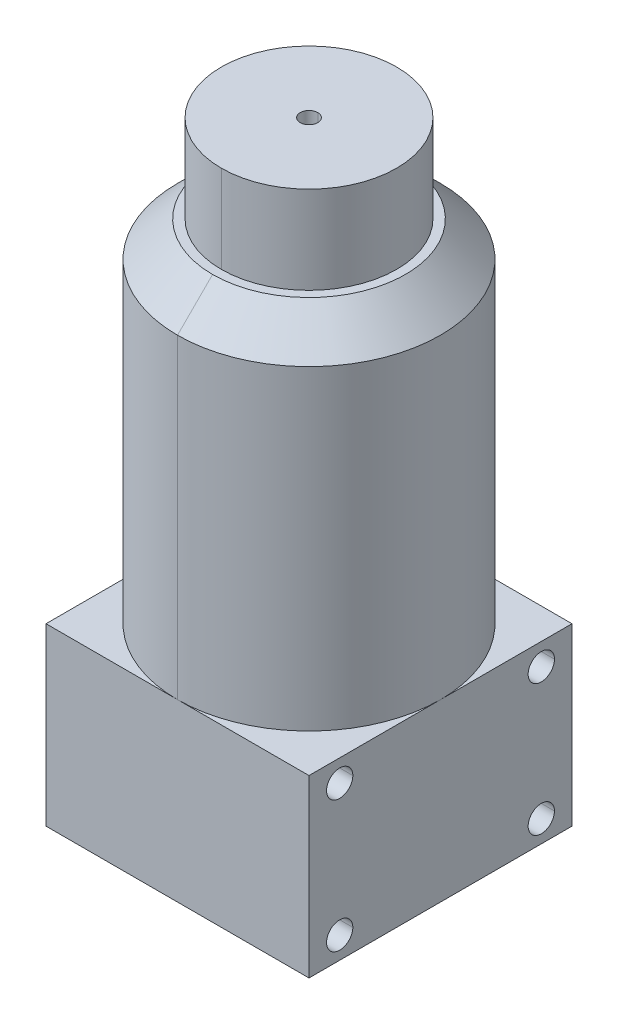
ISO-10303-21;
HEADER;
FILE_DESCRIPTION(('STEP AP214'),'2;1');
FILE_NAME('part.step','',(''),(''),'','','');
FILE_SCHEMA(('AUTOMOTIVE_DESIGN { 1 0 10303 214 1 1 1 1 }'));
ENDSEC;
DATA;
#1=APPLICATION_CONTEXT('core data for automotive mechanical design processes');
#2=APPLICATION_PROTOCOL_DEFINITION('international standard','automotive_design',2000,#1);
#3=PRODUCT_CONTEXT('',#1,'mechanical');
#4=PRODUCT('Part','Part','',(#3));
#5=PRODUCT_RELATED_PRODUCT_CATEGORY('part','',(#4));
#6=PRODUCT_DEFINITION_FORMATION('','',#4);
#7=PRODUCT_DEFINITION_CONTEXT('part definition',#1,'design');
#8=PRODUCT_DEFINITION('design','',#6,#7);
#9=PRODUCT_DEFINITION_SHAPE('','',#8);
#10=(LENGTH_UNIT() NAMED_UNIT(*) SI_UNIT(.MILLI.,.METRE.));
#11=(NAMED_UNIT(*) PLANE_ANGLE_UNIT() SI_UNIT($,.RADIAN.));
#12=(NAMED_UNIT(*) SI_UNIT($,.STERADIAN.) SOLID_ANGLE_UNIT());
#13=UNCERTAINTY_MEASURE_WITH_UNIT(LENGTH_MEASURE(1.E-05),#10,'distance_accuracy_value','');
#14=(GEOMETRIC_REPRESENTATION_CONTEXT(3) GLOBAL_UNCERTAINTY_ASSIGNED_CONTEXT((#13)) GLOBAL_UNIT_ASSIGNED_CONTEXT((#10,
#11,#12)) REPRESENTATION_CONTEXT('',''));
#15=CARTESIAN_POINT('',(0.,0.,0.));
#16=DIRECTION('',(0.,0.,1.));
#17=DIRECTION('',(1.,0.,0.));
#18=AXIS2_PLACEMENT_3D('',#15,#16,#17);
#19=CARTESIAN_POINT('',(0.,54.,0.));
#20=DIRECTION('',(0.,1.,0.));
#21=DIRECTION('',(1.,0.,0.));
#22=AXIS2_PLACEMENT_3D('',#19,#20,#21);
#23=PLANE('',#22);
#24=CARTESIAN_POINT('',(0.,54.,0.));
#25=DIRECTION('',(0.,1.,0.));
#26=DIRECTION('',(0.,0.,1.));
#27=AXIS2_PLACEMENT_3D('',#24,#25,#26);
#28=CIRCLE('',#27,1.);
#29=CARTESIAN_POINT('',(0.,54.,1.));
#30=VERTEX_POINT('',#29);
#31=CARTESIAN_POINT('',(0.,54.,-1.));
#32=VERTEX_POINT('',#31);
#33=EDGE_CURVE('E9',#30,#32,#28,.T.);
#34=ORIENTED_EDGE('',*,*,#33,.T.);
#35=CARTESIAN_POINT('',(0.,54.,0.));
#36=DIRECTION('',(0.,1.,0.));
#37=DIRECTION('',(0.,0.,1.));
#38=AXIS2_PLACEMENT_3D('',#35,#36,#37);
#39=CIRCLE('',#38,1.);
#40=EDGE_CURVE('E231',#32,#30,#39,.T.);
#41=ORIENTED_EDGE('',*,*,#40,.T.);
#42=EDGE_LOOP('',(#34,#41));
#43=FACE_BOUND('',#42,.T.);
#44=ADVANCED_FACE('F15',(#43),#23,.T.);
#45=CARTESIAN_POINT('',(0.,54.,0.));
#46=DIRECTION('',(0.,1.,0.));
#47=DIRECTION('',(0.,0.,1.));
#48=AXIS2_PLACEMENT_3D('',#45,#46,#47);
#49=CYLINDRICAL_SURFACE('',#48,1.);
#50=DIRECTION('',(0.,1.,0.));
#51=VECTOR('',#50,1.);
#52=CARTESIAN_POINT('',(0.,54.,-1.));
#53=LINE('',#52,#51);
#54=CARTESIAN_POINT('',(0.,70.,-1.));
#55=VERTEX_POINT('',#54);
#56=EDGE_CURVE('E212',#32,#55,#53,.T.);
#57=ORIENTED_EDGE('',*,*,#56,.F.);
#58=ORIENTED_EDGE('',*,*,#33,.F.);
#59=DIRECTION('',(0.,1.,0.));
#60=VECTOR('',#59,1.);
#61=CARTESIAN_POINT('',(0.,54.,1.));
#62=LINE('',#61,#60);
#63=CARTESIAN_POINT('',(0.,70.,1.));
#64=VERTEX_POINT('',#63);
#65=EDGE_CURVE('E211',#30,#64,#62,.T.);
#66=ORIENTED_EDGE('',*,*,#65,.T.);
#67=CARTESIAN_POINT('',(0.,70.,0.));
#68=DIRECTION('',(0.,1.,0.));
#69=DIRECTION('',(0.,0.,1.));
#70=AXIS2_PLACEMENT_3D('',#67,#68,#69);
#71=CIRCLE('',#70,1.);
#72=EDGE_CURVE('E26',#64,#55,#71,.T.);
#73=ORIENTED_EDGE('',*,*,#72,.T.);
#74=EDGE_LOOP('',(#57,#58,#66,#73));
#75=FACE_BOUND('',#74,.T.);
#76=ADVANCED_FACE('F652',(#75),#49,.F.);
#77=CARTESIAN_POINT('',(0.,60.,0.));
#78=DIRECTION('',(0.,-1.,0.));
#79=DIRECTION('',(0.,0.,-1.));
#80=AXIS2_PLACEMENT_3D('',#77,#78,#79);
#81=CONICAL_SURFACE('',#80,11.,0.785398163397447);
#82=DIRECTION('',(0.,-0.707106781186549,0.707106781186547));
#83=VECTOR('',#82,1.);
#84=CARTESIAN_POINT('',(0.,60.,11.));
#85=LINE('',#84,#83);
#86=CARTESIAN_POINT('',(0.,60.,11.));
#87=VERTEX_POINT('',#86);
#88=CARTESIAN_POINT('',(0.,56.,15.));
#89=VERTEX_POINT('',#88);
#90=EDGE_CURVE('E365',#87,#89,#85,.T.);
#91=ORIENTED_EDGE('',*,*,#90,.F.);
#92=CARTESIAN_POINT('',(0.,60.,0.));
#93=DIRECTION('',(0.,1.,0.));
#94=DIRECTION('',(0.,0.,1.));
#95=AXIS2_PLACEMENT_3D('',#92,#93,#94);
#96=CIRCLE('',#95,11.);
#97=CARTESIAN_POINT('',(0.,60.,-11.));
#98=VERTEX_POINT('',#97);
#99=EDGE_CURVE('E312',#98,#87,#96,.T.);
#100=ORIENTED_EDGE('',*,*,#99,.F.);
#101=DIRECTION('',(0.,-0.707106781186549,-0.707106781186547));
#102=VECTOR('',#101,1.);
#103=CARTESIAN_POINT('',(0.,60.,-11.));
#104=LINE('',#103,#102);
#105=CARTESIAN_POINT('',(0.,56.,-15.));
#106=VERTEX_POINT('',#105);
#107=EDGE_CURVE('E219',#98,#106,#104,.T.);
#108=ORIENTED_EDGE('',*,*,#107,.T.);
#109=CARTESIAN_POINT('',(0.,56.,0.));
#110=DIRECTION('',(0.,-1.,0.));
#111=DIRECTION('',(0.,0.,1.));
#112=AXIS2_PLACEMENT_3D('',#109,#110,#111);
#113=CIRCLE('',#112,15.);
#114=EDGE_CURVE('E336',#89,#106,#113,.T.);
#115=ORIENTED_EDGE('',*,*,#114,.F.);
#116=EDGE_LOOP('',(#91,#100,#108,#115));
#117=FACE_BOUND('',#116,.T.);
#118=ADVANCED_FACE('F647',(#117),#81,.T.);
#119=CARTESIAN_POINT('',(0.,70.,0.));
#120=DIRECTION('',(0.,1.,0.));
#121=DIRECTION('',(1.,0.,0.));
#122=AXIS2_PLACEMENT_3D('',#119,#120,#121);
#123=PLANE('',#122);
#124=ORIENTED_EDGE('',*,*,#72,.F.);
#125=CARTESIAN_POINT('',(0.,70.,0.));
#126=DIRECTION('',(0.,1.,0.));
#127=DIRECTION('',(0.,0.,1.));
#128=AXIS2_PLACEMENT_3D('',#125,#126,#127);
#129=CIRCLE('',#128,1.);
#130=EDGE_CURVE('E207',#55,#64,#129,.T.);
#131=ORIENTED_EDGE('',*,*,#130,.F.);
#132=EDGE_LOOP('',(#124,#131));
#133=FACE_BOUND('',#132,.T.);
#134=CARTESIAN_POINT('',(0.,70.,0.));
#135=DIRECTION('',(0.,1.,0.));
#136=DIRECTION('',(0.,0.,1.));
#137=AXIS2_PLACEMENT_3D('',#134,#135,#136);
#138=CIRCLE('',#137,10.);
#139=CARTESIAN_POINT('',(0.,70.,-10.));
#140=VERTEX_POINT('',#139);
#141=CARTESIAN_POINT('',(0.,70.,10.));
#142=VERTEX_POINT('',#141);
#143=EDGE_CURVE('E301',#140,#142,#138,.T.);
#144=ORIENTED_EDGE('',*,*,#143,.T.);
#145=CARTESIAN_POINT('',(0.,70.,0.));
#146=DIRECTION('',(0.,1.,0.));
#147=DIRECTION('',(0.,0.,1.));
#148=AXIS2_PLACEMENT_3D('',#145,#146,#147);
#149=CIRCLE('',#148,10.);
#150=EDGE_CURVE('E195',#142,#140,#149,.T.);
#151=ORIENTED_EDGE('',*,*,#150,.T.);
#152=EDGE_LOOP('',(#144,#151));
#153=FACE_BOUND('',#152,.T.);
#154=ADVANCED_FACE('F651',(#133,#153),#123,.T.);
#155=CARTESIAN_POINT('',(0.,70.,0.));
#156=DIRECTION('',(0.,-1.,0.));
#157=DIRECTION('',(0.,0.,-1.));
#158=AXIS2_PLACEMENT_3D('',#155,#156,#157);
#159=CYLINDRICAL_SURFACE('',#158,10.);
#160=DIRECTION('',(0.,-1.,0.));
#161=VECTOR('',#160,1.);
#162=CARTESIAN_POINT('',(0.,70.,10.));
#163=LINE('',#162,#161);
#164=CARTESIAN_POINT('',(0.,60.,10.));
#165=VERTEX_POINT('',#164);
#166=EDGE_CURVE('E328',#142,#165,#163,.T.);
#167=ORIENTED_EDGE('',*,*,#166,.F.);
#168=ORIENTED_EDGE('',*,*,#143,.F.);
#169=DIRECTION('',(0.,-1.,0.));
#170=VECTOR('',#169,1.);
#171=CARTESIAN_POINT('',(0.,70.,-10.));
#172=LINE('',#171,#170);
#173=CARTESIAN_POINT('',(0.,60.,-10.));
#174=VERTEX_POINT('',#173);
#175=EDGE_CURVE('E327',#140,#174,#172,.T.);
#176=ORIENTED_EDGE('',*,*,#175,.T.);
#177=CARTESIAN_POINT('',(0.,60.,0.));
#178=DIRECTION('',(0.,1.,0.));
#179=DIRECTION('',(0.,0.,1.));
#180=AXIS2_PLACEMENT_3D('',#177,#178,#179);
#181=CIRCLE('',#180,10.);
#182=EDGE_CURVE('E308',#174,#165,#181,.T.);
#183=ORIENTED_EDGE('',*,*,#182,.T.);
#184=EDGE_LOOP('',(#167,#168,#176,#183));
#185=FACE_BOUND('',#184,.T.);
#186=ADVANCED_FACE('F726',(#185),#159,.T.);
#187=CARTESIAN_POINT('',(5.,17.5,-11.5));
#188=DIRECTION('',(1.,0.,0.));
#189=DIRECTION('',(0.,1.,0.));
#190=AXIS2_PLACEMENT_3D('',#187,#188,#189);
#191=PLANE('',#190);
#192=CARTESIAN_POINT('',(5.,17.5,-11.5));
#193=DIRECTION('',(1.,0.,0.));
#194=DIRECTION('',(0.,0.,-1.));
#195=AXIS2_PLACEMENT_3D('',#192,#193,#194);
#196=CIRCLE('',#195,1.5);
#197=CARTESIAN_POINT('',(5.,17.5,-13.));
#198=VERTEX_POINT('',#197);
#199=CARTESIAN_POINT('',(5.,17.5,-10.));
#200=VERTEX_POINT('',#199);
#201=EDGE_CURVE('E176',#198,#200,#196,.T.);
#202=ORIENTED_EDGE('',*,*,#201,.T.);
#203=CARTESIAN_POINT('',(5.,17.5,-11.5));
#204=DIRECTION('',(1.,0.,0.));
#205=DIRECTION('',(0.,0.,-1.));
#206=AXIS2_PLACEMENT_3D('',#203,#204,#205);
#207=CIRCLE('',#206,1.5);
#208=EDGE_CURVE('E191',#200,#198,#207,.T.);
#209=ORIENTED_EDGE('',*,*,#208,.T.);
#210=EDGE_LOOP('',(#202,#209));
#211=FACE_BOUND('',#210,.T.);
#212=ADVANCED_FACE('F670',(#211),#191,.T.);
#213=CARTESIAN_POINT('',(5.,17.5,-11.5));
#214=DIRECTION('',(1.,0.,0.));
#215=DIRECTION('',(0.,0.,-1.));
#216=AXIS2_PLACEMENT_3D('',#213,#214,#215);
#217=CYLINDRICAL_SURFACE('',#216,1.5);
#218=DIRECTION('',(1.,0.,0.));
#219=VECTOR('',#218,1.);
#220=CARTESIAN_POINT('',(5.,17.5,-10.));
#221=LINE('',#220,#219);
#222=CARTESIAN_POINT('',(15.,17.5,-10.));
#223=VERTEX_POINT('',#222);
#224=EDGE_CURVE('E183',#200,#223,#221,.T.);
#225=ORIENTED_EDGE('',*,*,#224,.F.);
#226=ORIENTED_EDGE('',*,*,#201,.F.);
#227=DIRECTION('',(1.,0.,0.));
#228=VECTOR('',#227,1.);
#229=CARTESIAN_POINT('',(5.,17.5,-13.));
#230=LINE('',#229,#228);
#231=CARTESIAN_POINT('',(15.,17.5,-13.));
#232=VERTEX_POINT('',#231);
#233=EDGE_CURVE('E174',#198,#232,#230,.T.);
#234=ORIENTED_EDGE('',*,*,#233,.T.);
#235=CARTESIAN_POINT('',(15.,17.5,-11.5));
#236=DIRECTION('',(1.,0.,0.));
#237=DIRECTION('',(0.,0.,-1.));
#238=AXIS2_PLACEMENT_3D('',#235,#236,#237);
#239=CIRCLE('',#238,1.5);
#240=EDGE_CURVE('E160',#232,#223,#239,.T.);
#241=ORIENTED_EDGE('',*,*,#240,.T.);
#242=EDGE_LOOP('',(#225,#226,#234,#241));
#243=FACE_BOUND('',#242,.T.);
#244=ADVANCED_FACE('F175',(#243),#217,.F.);
#245=CARTESIAN_POINT('',(5.,2.5,-11.5));
#246=DIRECTION('',(1.,0.,0.));
#247=DIRECTION('',(0.,1.,0.));
#248=AXIS2_PLACEMENT_3D('',#245,#246,#247);
#249=PLANE('',#248);
#250=CARTESIAN_POINT('',(5.,2.5,-11.5));
#251=DIRECTION('',(1.,0.,0.));
#252=DIRECTION('',(0.,0.,-1.));
#253=AXIS2_PLACEMENT_3D('',#250,#251,#252);
#254=CIRCLE('',#253,1.5);
#255=CARTESIAN_POINT('',(5.,2.5,-13.));
#256=VERTEX_POINT('',#255);
#257=CARTESIAN_POINT('',(5.,2.5,-10.));
#258=VERTEX_POINT('',#257);
#259=EDGE_CURVE('E322',#256,#258,#254,.T.);
#260=ORIENTED_EDGE('',*,*,#259,.T.);
#261=CARTESIAN_POINT('',(5.,2.5,-11.5));
#262=DIRECTION('',(1.,0.,0.));
#263=DIRECTION('',(0.,0.,-1.));
#264=AXIS2_PLACEMENT_3D('',#261,#262,#263);
#265=CIRCLE('',#264,1.5);
#266=EDGE_CURVE('E181',#258,#256,#265,.T.);
#267=ORIENTED_EDGE('',*,*,#266,.T.);
#268=EDGE_LOOP('',(#260,#267));
#269=FACE_BOUND('',#268,.T.);
#270=ADVANCED_FACE('F669',(#269),#249,.T.);
#271=CARTESIAN_POINT('',(5.,2.5,-11.5));
#272=DIRECTION('',(1.,0.,0.));
#273=DIRECTION('',(0.,0.,-1.));
#274=AXIS2_PLACEMENT_3D('',#271,#272,#273);
#275=CYLINDRICAL_SURFACE('',#274,1.5);
#276=DIRECTION('',(1.,0.,0.));
#277=VECTOR('',#276,1.);
#278=CARTESIAN_POINT('',(5.,2.5,-10.));
#279=LINE('',#278,#277);
#280=CARTESIAN_POINT('',(15.,2.5,-10.));
#281=VERTEX_POINT('',#280);
#282=EDGE_CURVE('E224',#258,#281,#279,.T.);
#283=ORIENTED_EDGE('',*,*,#282,.F.);
#284=ORIENTED_EDGE('',*,*,#259,.F.);
#285=DIRECTION('',(1.,0.,0.));
#286=VECTOR('',#285,1.);
#287=CARTESIAN_POINT('',(5.,2.5,-13.));
#288=LINE('',#287,#286);
#289=CARTESIAN_POINT('',(15.,2.5,-13.));
#290=VERTEX_POINT('',#289);
#291=EDGE_CURVE('E197',#256,#290,#288,.T.);
#292=ORIENTED_EDGE('',*,*,#291,.T.);
#293=CARTESIAN_POINT('',(15.,2.5,-11.5));
#294=DIRECTION('',(1.,0.,0.));
#295=DIRECTION('',(0.,0.,-1.));
#296=AXIS2_PLACEMENT_3D('',#293,#294,#295);
#297=CIRCLE('',#296,1.5);
#298=EDGE_CURVE('E170',#290,#281,#297,.T.);
#299=ORIENTED_EDGE('',*,*,#298,.T.);
#300=EDGE_LOOP('',(#283,#284,#292,#299));
#301=FACE_BOUND('',#300,.T.);
#302=ADVANCED_FACE('F774',(#301),#275,.F.);
#303=CARTESIAN_POINT('',(5.,2.5,11.5));
#304=DIRECTION('',(1.,0.,0.));
#305=DIRECTION('',(0.,1.,0.));
#306=AXIS2_PLACEMENT_3D('',#303,#304,#305);
#307=PLANE('',#306);
#308=CARTESIAN_POINT('',(5.,2.5,11.5));
#309=DIRECTION('',(1.,0.,0.));
#310=DIRECTION('',(0.,0.,-1.));
#311=AXIS2_PLACEMENT_3D('',#308,#309,#310);
#312=CIRCLE('',#311,1.5);
#313=CARTESIAN_POINT('',(5.,2.5,10.));
#314=VERTEX_POINT('',#313);
#315=CARTESIAN_POINT('',(5.,2.5,13.));
#316=VERTEX_POINT('',#315);
#317=EDGE_CURVE('E319',#314,#316,#312,.T.);
#318=ORIENTED_EDGE('',*,*,#317,.T.);
#319=CARTESIAN_POINT('',(5.,2.5,11.5));
#320=DIRECTION('',(1.,0.,0.));
#321=DIRECTION('',(0.,0.,-1.));
#322=AXIS2_PLACEMENT_3D('',#319,#320,#321);
#323=CIRCLE('',#322,1.5);
#324=EDGE_CURVE('E200',#316,#314,#323,.T.);
#325=ORIENTED_EDGE('',*,*,#324,.T.);
#326=EDGE_LOOP('',(#318,#325));
#327=FACE_BOUND('',#326,.T.);
#328=ADVANCED_FACE('F679',(#327),#307,.T.);
#329=CARTESIAN_POINT('',(5.,2.5,11.5));
#330=DIRECTION('',(1.,0.,0.));
#331=DIRECTION('',(0.,0.,-1.));
#332=AXIS2_PLACEMENT_3D('',#329,#330,#331);
#333=CYLINDRICAL_SURFACE('',#332,1.5);
#334=DIRECTION('',(1.,0.,0.));
#335=VECTOR('',#334,1.);
#336=CARTESIAN_POINT('',(5.,2.5,13.));
#337=LINE('',#336,#335);
#338=CARTESIAN_POINT('',(15.,2.5,13.));
#339=VERTEX_POINT('',#338);
#340=EDGE_CURVE('E316',#316,#339,#337,.T.);
#341=ORIENTED_EDGE('',*,*,#340,.F.);
#342=ORIENTED_EDGE('',*,*,#317,.F.);
#343=DIRECTION('',(1.,0.,0.));
#344=VECTOR('',#343,1.);
#345=CARTESIAN_POINT('',(5.,2.5,10.));
#346=LINE('',#345,#344);
#347=CARTESIAN_POINT('',(15.,2.5,10.));
#348=VERTEX_POINT('',#347);
#349=EDGE_CURVE('E357',#314,#348,#346,.T.);
#350=ORIENTED_EDGE('',*,*,#349,.T.);
#351=CARTESIAN_POINT('',(15.,2.5,11.5));
#352=DIRECTION('',(1.,0.,0.));
#353=DIRECTION('',(0.,0.,-1.));
#354=AXIS2_PLACEMENT_3D('',#351,#352,#353);
#355=CIRCLE('',#354,1.5);
#356=EDGE_CURVE('E352',#348,#339,#355,.T.);
#357=ORIENTED_EDGE('',*,*,#356,.T.);
#358=EDGE_LOOP('',(#341,#342,#350,#357));
#359=FACE_BOUND('',#358,.T.);
#360=ADVANCED_FACE('F675',(#359),#333,.F.);
#361=CARTESIAN_POINT('',(5.,17.5,11.5));
#362=DIRECTION('',(1.,0.,0.));
#363=DIRECTION('',(0.,1.,0.));
#364=AXIS2_PLACEMENT_3D('',#361,#362,#363);
#365=PLANE('',#364);
#366=CARTESIAN_POINT('',(5.,17.5,11.5));
#367=DIRECTION('',(1.,0.,0.));
#368=DIRECTION('',(0.,0.,-1.));
#369=AXIS2_PLACEMENT_3D('',#366,#367,#368);
#370=CIRCLE('',#369,1.5);
#371=CARTESIAN_POINT('',(5.,17.5,10.));
#372=VERTEX_POINT('',#371);
#373=CARTESIAN_POINT('',(5.,17.5,13.));
#374=VERTEX_POINT('',#373);
#375=EDGE_CURVE('E311',#372,#374,#370,.T.);
#376=ORIENTED_EDGE('',*,*,#375,.T.);
#377=CARTESIAN_POINT('',(5.,17.5,11.5));
#378=DIRECTION('',(1.,0.,0.));
#379=DIRECTION('',(0.,0.,-1.));
#380=AXIS2_PLACEMENT_3D('',#377,#378,#379);
#381=CIRCLE('',#380,1.5);
#382=EDGE_CURVE('E402',#374,#372,#381,.T.);
#383=ORIENTED_EDGE('',*,*,#382,.T.);
#384=EDGE_LOOP('',(#376,#383));
#385=FACE_BOUND('',#384,.T.);
#386=ADVANCED_FACE('F440',(#385),#365,.T.);
#387=CARTESIAN_POINT('',(5.,17.5,11.5));
#388=DIRECTION('',(1.,0.,0.));
#389=DIRECTION('',(0.,0.,-1.));
#390=AXIS2_PLACEMENT_3D('',#387,#388,#389);
#391=CYLINDRICAL_SURFACE('',#390,1.5);
#392=DIRECTION('',(1.,0.,0.));
#393=VECTOR('',#392,1.);
#394=CARTESIAN_POINT('',(5.,17.5,13.));
#395=LINE('',#394,#393);
#396=CARTESIAN_POINT('',(15.,17.5,13.));
#397=VERTEX_POINT('',#396);
#398=EDGE_CURVE('E370',#374,#397,#395,.T.);
#399=ORIENTED_EDGE('',*,*,#398,.F.);
#400=ORIENTED_EDGE('',*,*,#375,.F.);
#401=DIRECTION('',(1.,0.,0.));
#402=VECTOR('',#401,1.);
#403=CARTESIAN_POINT('',(5.,17.5,10.));
#404=LINE('',#403,#402);
#405=CARTESIAN_POINT('',(15.,17.5,10.));
#406=VERTEX_POINT('',#405);
#407=EDGE_CURVE('E294',#372,#406,#404,.T.);
#408=ORIENTED_EDGE('',*,*,#407,.T.);
#409=CARTESIAN_POINT('',(15.,17.5,11.5));
#410=DIRECTION('',(1.,0.,0.));
#411=DIRECTION('',(0.,0.,-1.));
#412=AXIS2_PLACEMENT_3D('',#409,#410,#411);
#413=CIRCLE('',#412,1.5);
#414=EDGE_CURVE('E376',#406,#397,#413,.T.);
#415=ORIENTED_EDGE('',*,*,#414,.T.);
#416=EDGE_LOOP('',(#399,#400,#408,#415));
#417=FACE_BOUND('',#416,.T.);
#418=ADVANCED_FACE('F431',(#417),#391,.F.);
#419=CARTESIAN_POINT('',(0.,60.,0.));
#420=DIRECTION('',(0.,1.,0.));
#421=DIRECTION('',(1.,0.,0.));
#422=AXIS2_PLACEMENT_3D('',#419,#420,#421);
#423=PLANE('',#422);
#424=ORIENTED_EDGE('',*,*,#182,.F.);
#425=CARTESIAN_POINT('',(0.,60.,0.));
#426=DIRECTION('',(0.,1.,0.));
#427=DIRECTION('',(0.,0.,1.));
#428=AXIS2_PLACEMENT_3D('',#425,#426,#427);
#429=CIRCLE('',#428,10.);
#430=EDGE_CURVE('E323',#165,#174,#429,.T.);
#431=ORIENTED_EDGE('',*,*,#430,.F.);
#432=EDGE_LOOP('',(#424,#431));
#433=FACE_BOUND('',#432,.T.);
#434=ORIENTED_EDGE('',*,*,#99,.T.);
#435=CARTESIAN_POINT('',(0.,60.,0.));
#436=DIRECTION('',(0.,1.,0.));
#437=DIRECTION('',(0.,0.,1.));
#438=AXIS2_PLACEMENT_3D('',#435,#436,#437);
#439=CIRCLE('',#438,11.);
#440=EDGE_CURVE('E361',#87,#98,#439,.T.);
#441=ORIENTED_EDGE('',*,*,#440,.T.);
#442=EDGE_LOOP('',(#434,#441));
#443=FACE_BOUND('',#442,.T.);
#444=ADVANCED_FACE('F661',(#433,#443),#423,.T.);
#445=CARTESIAN_POINT('',(0.,60.,0.));
#446=DIRECTION('',(0.,-1.,0.));
#447=DIRECTION('',(0.,0.,-1.));
#448=AXIS2_PLACEMENT_3D('',#445,#446,#447);
#449=CYLINDRICAL_SURFACE('',#448,15.);
#450=DIRECTION('',(0.,-1.,0.));
#451=VECTOR('',#450,1.);
#452=CARTESIAN_POINT('',(0.,60.,15.));
#453=LINE('',#452,#451);
#454=CARTESIAN_POINT('',(0.,20.,15.));
#455=VERTEX_POINT('',#454);
#456=EDGE_CURVE('E287',#89,#455,#453,.T.);
#457=ORIENTED_EDGE('',*,*,#456,.F.);
#458=ORIENTED_EDGE('',*,*,#114,.T.);
#459=DIRECTION('',(0.,-1.,0.));
#460=VECTOR('',#459,1.);
#461=CARTESIAN_POINT('',(0.,60.,-15.));
#462=LINE('',#461,#460);
#463=CARTESIAN_POINT('',(0.,20.,-15.));
#464=VERTEX_POINT('',#463);
#465=EDGE_CURVE('E235',#106,#464,#462,.T.);
#466=ORIENTED_EDGE('',*,*,#465,.T.);
#467=CARTESIAN_POINT('',(0.,20.,0.));
#468=DIRECTION('',(0.,1.,0.));
#469=DIRECTION('',(0.,0.,1.));
#470=AXIS2_PLACEMENT_3D('',#467,#468,#469);
#471=CIRCLE('',#470,15.);
#472=CARTESIAN_POINT('',(-15.,20.,0.));
#473=VERTEX_POINT('',#472);
#474=EDGE_CURVE('E300',#464,#473,#471,.T.);
#475=ORIENTED_EDGE('',*,*,#474,.T.);
#476=CARTESIAN_POINT('',(0.,20.,0.));
#477=DIRECTION('',(0.,1.,0.));
#478=DIRECTION('',(0.,0.,1.));
#479=AXIS2_PLACEMENT_3D('',#476,#477,#478);
#480=CIRCLE('',#479,15.);
#481=EDGE_CURVE('E334',#473,#455,#480,.T.);
#482=ORIENTED_EDGE('',*,*,#481,.T.);
#483=EDGE_LOOP('',(#457,#458,#466,#475,#482));
#484=FACE_BOUND('',#483,.T.);
#485=ADVANCED_FACE('F642',(#484),#449,.T.);
#486=CARTESIAN_POINT('',(0.,0.,0.));
#487=DIRECTION('',(0.,-1.,0.));
#488=DIRECTION('',(0.,0.,-1.));
#489=AXIS2_PLACEMENT_3D('',#486,#487,#488);
#490=PLANE('',#489);
#491=DIRECTION('',(0.,0.,-1.));
#492=VECTOR('',#491,1.);
#493=CARTESIAN_POINT('',(15.,0.,15.));
#494=LINE('',#493,#492);
#495=CARTESIAN_POINT('',(15.,0.,15.));
#496=VERTEX_POINT('',#495);
#497=CARTESIAN_POINT('',(15.,0.,-15.));
#498=VERTEX_POINT('',#497);
#499=EDGE_CURVE('E217',#496,#498,#494,.T.);
#500=ORIENTED_EDGE('',*,*,#499,.F.);
#501=DIRECTION('',(1.,0.,0.));
#502=VECTOR('',#501,1.);
#503=CARTESIAN_POINT('',(-15.,0.,15.));
#504=LINE('',#503,#502);
#505=CARTESIAN_POINT('',(-15.,0.,15.));
#506=VERTEX_POINT('',#505);
#507=EDGE_CURVE('E335',#506,#496,#504,.T.);
#508=ORIENTED_EDGE('',*,*,#507,.F.);
#509=DIRECTION('',(0.,0.,1.));
#510=VECTOR('',#509,1.);
#511=CARTESIAN_POINT('',(-15.,0.,15.));
#512=LINE('',#511,#510);
#513=CARTESIAN_POINT('',(-15.,0.,-15.));
#514=VERTEX_POINT('',#513);
#515=EDGE_CURVE('E206',#514,#506,#512,.T.);
#516=ORIENTED_EDGE('',*,*,#515,.F.);
#517=DIRECTION('',(-1.,0.,0.));
#518=VECTOR('',#517,1.);
#519=CARTESIAN_POINT('',(-15.,0.,-15.));
#520=LINE('',#519,#518);
#521=EDGE_CURVE('E255',#498,#514,#520,.T.);
#522=ORIENTED_EDGE('',*,*,#521,.F.);
#523=EDGE_LOOP('',(#500,#508,#516,#522));
#524=FACE_BOUND('',#523,.T.);
#525=ADVANCED_FACE('F637',(#524),#490,.T.);
#526=CARTESIAN_POINT('',(0.,20.,0.));
#527=DIRECTION('',(0.,-1.,0.));
#528=DIRECTION('',(0.,0.,-1.));
#529=AXIS2_PLACEMENT_3D('',#526,#527,#528);
#530=PLANE('',#529);
#531=ORIENTED_EDGE('',*,*,#481,.F.);
#532=DIRECTION('',(0.,0.,1.));
#533=VECTOR('',#532,1.);
#534=CARTESIAN_POINT('',(-15.,20.,15.));
#535=LINE('',#534,#533);
#536=CARTESIAN_POINT('',(-15.,20.,15.));
#537=VERTEX_POINT('',#536);
#538=EDGE_CURVE('E205',#473,#537,#535,.T.);
#539=ORIENTED_EDGE('',*,*,#538,.T.);
#540=DIRECTION('',(1.,0.,0.));
#541=VECTOR('',#540,1.);
#542=CARTESIAN_POINT('',(-15.,20.,15.));
#543=LINE('',#542,#541);
#544=EDGE_CURVE('E41',#537,#455,#543,.T.);
#545=ORIENTED_EDGE('',*,*,#544,.T.);
#546=EDGE_LOOP('',(#531,#539,#545));
#547=FACE_BOUND('',#546,.T.);
#548=ADVANCED_FACE('F641',(#547),#530,.F.);
#549=CARTESIAN_POINT('',(-15.,20.,15.));
#550=DIRECTION('',(0.,0.,-1.));
#551=DIRECTION('',(-1.,0.,0.));
#552=AXIS2_PLACEMENT_3D('',#549,#550,#551);
#553=PLANE('',#552);
#554=ORIENTED_EDGE('',*,*,#507,.T.);
#555=DIRECTION('',(0.,-1.,0.));
#556=VECTOR('',#555,1.);
#557=CARTESIAN_POINT('',(15.,20.,15.));
#558=LINE('',#557,#556);
#559=CARTESIAN_POINT('',(15.,20.,15.));
#560=VERTEX_POINT('',#559);
#561=EDGE_CURVE('E171',#560,#496,#558,.T.);
#562=ORIENTED_EDGE('',*,*,#561,.F.);
#563=DIRECTION('',(1.,0.,0.));
#564=VECTOR('',#563,1.);
#565=CARTESIAN_POINT('',(-15.,20.,15.));
#566=LINE('',#565,#564);
#567=EDGE_CURVE('E238',#455,#560,#566,.T.);
#568=ORIENTED_EDGE('',*,*,#567,.F.);
#569=ORIENTED_EDGE('',*,*,#544,.F.);
#570=DIRECTION('',(0.,-1.,0.));
#571=VECTOR('',#570,1.);
#572=CARTESIAN_POINT('',(-15.,20.,15.));
#573=LINE('',#572,#571);
#574=EDGE_CURVE('E202',#537,#506,#573,.T.);
#575=ORIENTED_EDGE('',*,*,#574,.T.);
#576=EDGE_LOOP('',(#554,#562,#568,#569,#575));
#577=FACE_BOUND('',#576,.T.);
#578=ADVANCED_FACE('F707',(#577),#553,.F.);
#579=CARTESIAN_POINT('',(-15.,20.,15.));
#580=DIRECTION('',(1.,0.,0.));
#581=DIRECTION('',(0.,1.,0.));
#582=AXIS2_PLACEMENT_3D('',#579,#580,#581);
#583=PLANE('',#582);
#584=ORIENTED_EDGE('',*,*,#515,.T.);
#585=ORIENTED_EDGE('',*,*,#574,.F.);
#586=ORIENTED_EDGE('',*,*,#538,.F.);
#587=DIRECTION('',(0.,0.,1.));
#588=VECTOR('',#587,1.);
#589=CARTESIAN_POINT('',(-15.,20.,15.));
#590=LINE('',#589,#588);
#591=CARTESIAN_POINT('',(-15.,20.,-15.));
#592=VERTEX_POINT('',#591);
#593=EDGE_CURVE('E213',#592,#473,#590,.T.);
#594=ORIENTED_EDGE('',*,*,#593,.F.);
#595=DIRECTION('',(0.,-1.,0.));
#596=VECTOR('',#595,1.);
#597=CARTESIAN_POINT('',(-15.,20.,-15.));
#598=LINE('',#597,#596);
#599=EDGE_CURVE('E342',#592,#514,#598,.T.);
#600=ORIENTED_EDGE('',*,*,#599,.T.);
#601=EDGE_LOOP('',(#584,#585,#586,#594,#600));
#602=FACE_BOUND('',#601,.T.);
#603=ADVANCED_FACE('F711',(#602),#583,.F.);
#604=CARTESIAN_POINT('',(-15.,20.,-15.));
#605=DIRECTION('',(0.,0.,1.));
#606=DIRECTION('',(1.,0.,0.));
#607=AXIS2_PLACEMENT_3D('',#604,#605,#606);
#608=PLANE('',#607);
#609=ORIENTED_EDGE('',*,*,#521,.T.);
#610=ORIENTED_EDGE('',*,*,#599,.F.);
#611=DIRECTION('',(-1.,0.,0.));
#612=VECTOR('',#611,1.);
#613=CARTESIAN_POINT('',(-15.,20.,-15.));
#614=LINE('',#613,#612);
#615=EDGE_CURVE('E218',#464,#592,#614,.T.);
#616=ORIENTED_EDGE('',*,*,#615,.F.);
#617=DIRECTION('',(-1.,0.,0.));
#618=VECTOR('',#617,1.);
#619=CARTESIAN_POINT('',(-15.,20.,-15.));
#620=LINE('',#619,#618);
#621=CARTESIAN_POINT('',(15.,20.,-15.));
#622=VERTEX_POINT('',#621);
#623=EDGE_CURVE('E257',#622,#464,#620,.T.);
#624=ORIENTED_EDGE('',*,*,#623,.F.);
#625=DIRECTION('',(0.,-1.,0.));
#626=VECTOR('',#625,1.);
#627=CARTESIAN_POINT('',(15.,20.,-15.));
#628=LINE('',#627,#626);
#629=EDGE_CURVE('E19',#622,#498,#628,.T.);
#630=ORIENTED_EDGE('',*,*,#629,.T.);
#631=EDGE_LOOP('',(#609,#610,#616,#624,#630));
#632=FACE_BOUND('',#631,.T.);
#633=ADVANCED_FACE('F253',(#632),#608,.F.);
#634=CARTESIAN_POINT('',(15.,20.,15.));
#635=DIRECTION('',(-1.,0.,0.));
#636=DIRECTION('',(0.,0.,1.));
#637=AXIS2_PLACEMENT_3D('',#634,#635,#636);
#638=PLANE('',#637);
#639=ORIENTED_EDGE('',*,*,#414,.F.);
#640=CARTESIAN_POINT('',(15.,17.5,11.5));
#641=DIRECTION('',(1.,0.,0.));
#642=DIRECTION('',(0.,0.,-1.));
#643=AXIS2_PLACEMENT_3D('',#640,#641,#642);
#644=CIRCLE('',#643,1.5);
#645=EDGE_CURVE('E366',#397,#406,#644,.T.);
#646=ORIENTED_EDGE('',*,*,#645,.F.);
#647=EDGE_LOOP('',(#639,#646));
#648=FACE_BOUND('',#647,.T.);
#649=ORIENTED_EDGE('',*,*,#356,.F.);
#650=CARTESIAN_POINT('',(15.,2.5,11.5));
#651=DIRECTION('',(1.,0.,0.));
#652=DIRECTION('',(0.,0.,-1.));
#653=AXIS2_PLACEMENT_3D('',#650,#651,#652);
#654=CIRCLE('',#653,1.5);
#655=EDGE_CURVE('E353',#339,#348,#654,.T.);
#656=ORIENTED_EDGE('',*,*,#655,.F.);
#657=EDGE_LOOP('',(#649,#656));
#658=FACE_BOUND('',#657,.T.);
#659=ORIENTED_EDGE('',*,*,#298,.F.);
#660=CARTESIAN_POINT('',(15.,2.5,-11.5));
#661=DIRECTION('',(1.,0.,0.));
#662=DIRECTION('',(0.,0.,-1.));
#663=AXIS2_PLACEMENT_3D('',#660,#661,#662);
#664=CIRCLE('',#663,1.5);
#665=EDGE_CURVE('E201',#281,#290,#664,.T.);
#666=ORIENTED_EDGE('',*,*,#665,.F.);
#667=EDGE_LOOP('',(#659,#666));
#668=FACE_BOUND('',#667,.T.);
#669=ORIENTED_EDGE('',*,*,#240,.F.);
#670=CARTESIAN_POINT('',(15.,17.5,-11.5));
#671=DIRECTION('',(1.,0.,0.));
#672=DIRECTION('',(0.,0.,-1.));
#673=AXIS2_PLACEMENT_3D('',#670,#671,#672);
#674=CIRCLE('',#673,1.5);
#675=EDGE_CURVE('E165',#223,#232,#674,.T.);
#676=ORIENTED_EDGE('',*,*,#675,.F.);
#677=EDGE_LOOP('',(#669,#676));
#678=FACE_BOUND('',#677,.T.);
#679=ORIENTED_EDGE('',*,*,#499,.T.);
#680=ORIENTED_EDGE('',*,*,#629,.F.);
#681=DIRECTION('',(0.,0.,-1.));
#682=VECTOR('',#681,1.);
#683=CARTESIAN_POINT('',(15.,20.,15.));
#684=LINE('',#683,#682);
#685=CARTESIAN_POINT('',(15.,20.,0.));
#686=VERTEX_POINT('',#685);
#687=EDGE_CURVE('E262',#686,#622,#684,.T.);
#688=ORIENTED_EDGE('',*,*,#687,.F.);
#689=DIRECTION('',(0.,0.,-1.));
#690=VECTOR('',#689,1.);
#691=CARTESIAN_POINT('',(15.,20.,15.));
#692=LINE('',#691,#690);
#693=EDGE_CURVE('E264',#560,#686,#692,.T.);
#694=ORIENTED_EDGE('',*,*,#693,.F.);
#695=ORIENTED_EDGE('',*,*,#561,.T.);
#696=EDGE_LOOP('',(#679,#680,#688,#694,#695));
#697=FACE_BOUND('',#696,.T.);
#698=ADVANCED_FACE('F162',(#648,#658,#668,#678,#697),#638,.F.);
#699=CARTESIAN_POINT('',(0.,20.,0.));
#700=DIRECTION('',(0.,-1.,0.));
#701=DIRECTION('',(0.,0.,-1.));
#702=AXIS2_PLACEMENT_3D('',#699,#700,#701);
#703=PLANE('',#702);
#704=ORIENTED_EDGE('',*,*,#474,.F.);
#705=ORIENTED_EDGE('',*,*,#615,.T.);
#706=ORIENTED_EDGE('',*,*,#593,.T.);
#707=EDGE_LOOP('',(#704,#705,#706));
#708=FACE_BOUND('',#707,.T.);
#709=ADVANCED_FACE('F695',(#708),#703,.F.);
#710=CARTESIAN_POINT('',(0.,20.,0.));
#711=DIRECTION('',(0.,-1.,0.));
#712=DIRECTION('',(0.,0.,-1.));
#713=AXIS2_PLACEMENT_3D('',#710,#711,#712);
#714=PLANE('',#713);
#715=CARTESIAN_POINT('',(0.,20.,0.));
#716=DIRECTION('',(0.,1.,0.));
#717=DIRECTION('',(0.,0.,1.));
#718=AXIS2_PLACEMENT_3D('',#715,#716,#717);
#719=CIRCLE('',#718,15.);
#720=EDGE_CURVE('E239',#686,#464,#719,.T.);
#721=ORIENTED_EDGE('',*,*,#720,.F.);
#722=ORIENTED_EDGE('',*,*,#687,.T.);
#723=ORIENTED_EDGE('',*,*,#623,.T.);
#724=EDGE_LOOP('',(#721,#722,#723));
#725=FACE_BOUND('',#724,.T.);
#726=ADVANCED_FACE('F279',(#725),#714,.F.);
#727=CARTESIAN_POINT('',(0.,20.,0.));
#728=DIRECTION('',(0.,-1.,0.));
#729=DIRECTION('',(0.,0.,-1.));
#730=AXIS2_PLACEMENT_3D('',#727,#728,#729);
#731=PLANE('',#730);
#732=CARTESIAN_POINT('',(0.,20.,0.));
#733=DIRECTION('',(0.,1.,0.));
#734=DIRECTION('',(0.,0.,1.));
#735=AXIS2_PLACEMENT_3D('',#732,#733,#734);
#736=CIRCLE('',#735,15.);
#737=EDGE_CURVE('E274',#455,#686,#736,.T.);
#738=ORIENTED_EDGE('',*,*,#737,.F.);
#739=ORIENTED_EDGE('',*,*,#567,.T.);
#740=ORIENTED_EDGE('',*,*,#693,.T.);
#741=EDGE_LOOP('',(#738,#739,#740));
#742=FACE_BOUND('',#741,.T.);
#743=ADVANCED_FACE('F272',(#742),#731,.F.);
#744=CARTESIAN_POINT('',(0.,60.,0.));
#745=DIRECTION('',(0.,-1.,0.));
#746=DIRECTION('',(0.,0.,-1.));
#747=AXIS2_PLACEMENT_3D('',#744,#745,#746);
#748=CYLINDRICAL_SURFACE('',#747,15.);
#749=CARTESIAN_POINT('',(0.,56.,0.));
#750=DIRECTION('',(0.,-1.,0.));
#751=DIRECTION('',(0.,0.,1.));
#752=AXIS2_PLACEMENT_3D('',#749,#750,#751);
#753=CIRCLE('',#752,15.);
#754=EDGE_CURVE('E223',#106,#89,#753,.T.);
#755=ORIENTED_EDGE('',*,*,#754,.T.);
#756=ORIENTED_EDGE('',*,*,#456,.T.);
#757=ORIENTED_EDGE('',*,*,#737,.T.);
#758=ORIENTED_EDGE('',*,*,#720,.T.);
#759=ORIENTED_EDGE('',*,*,#465,.F.);
#760=EDGE_LOOP('',(#755,#756,#757,#758,#759));
#761=FACE_BOUND('',#760,.T.);
#762=ADVANCED_FACE('F285',(#761),#748,.T.);
#763=CARTESIAN_POINT('',(5.,17.5,11.5));
#764=DIRECTION('',(1.,0.,0.));
#765=DIRECTION('',(0.,0.,-1.));
#766=AXIS2_PLACEMENT_3D('',#763,#764,#765);
#767=CYLINDRICAL_SURFACE('',#766,1.5);
#768=ORIENTED_EDGE('',*,*,#382,.F.);
#769=ORIENTED_EDGE('',*,*,#398,.T.);
#770=ORIENTED_EDGE('',*,*,#645,.T.);
#771=ORIENTED_EDGE('',*,*,#407,.F.);
#772=EDGE_LOOP('',(#768,#769,#770,#771));
#773=FACE_BOUND('',#772,.T.);
#774=ADVANCED_FACE('F438',(#773),#767,.F.);
#775=CARTESIAN_POINT('',(5.,2.5,11.5));
#776=DIRECTION('',(1.,0.,0.));
#777=DIRECTION('',(0.,0.,-1.));
#778=AXIS2_PLACEMENT_3D('',#775,#776,#777);
#779=CYLINDRICAL_SURFACE('',#778,1.5);
#780=ORIENTED_EDGE('',*,*,#324,.F.);
#781=ORIENTED_EDGE('',*,*,#340,.T.);
#782=ORIENTED_EDGE('',*,*,#655,.T.);
#783=ORIENTED_EDGE('',*,*,#349,.F.);
#784=EDGE_LOOP('',(#780,#781,#782,#783));
#785=FACE_BOUND('',#784,.T.);
#786=ADVANCED_FACE('F814',(#785),#779,.F.);
#787=CARTESIAN_POINT('',(5.,2.5,-11.5));
#788=DIRECTION('',(1.,0.,0.));
#789=DIRECTION('',(0.,0.,-1.));
#790=AXIS2_PLACEMENT_3D('',#787,#788,#789);
#791=CYLINDRICAL_SURFACE('',#790,1.5);
#792=ORIENTED_EDGE('',*,*,#266,.F.);
#793=ORIENTED_EDGE('',*,*,#282,.T.);
#794=ORIENTED_EDGE('',*,*,#665,.T.);
#795=ORIENTED_EDGE('',*,*,#291,.F.);
#796=EDGE_LOOP('',(#792,#793,#794,#795));
#797=FACE_BOUND('',#796,.T.);
#798=ADVANCED_FACE('F633',(#797),#791,.F.);
#799=CARTESIAN_POINT('',(5.,17.5,-11.5));
#800=DIRECTION('',(1.,0.,0.));
#801=DIRECTION('',(0.,0.,-1.));
#802=AXIS2_PLACEMENT_3D('',#799,#800,#801);
#803=CYLINDRICAL_SURFACE('',#802,1.5);
#804=ORIENTED_EDGE('',*,*,#208,.F.);
#805=ORIENTED_EDGE('',*,*,#224,.T.);
#806=ORIENTED_EDGE('',*,*,#675,.T.);
#807=ORIENTED_EDGE('',*,*,#233,.F.);
#808=EDGE_LOOP('',(#804,#805,#806,#807));
#809=FACE_BOUND('',#808,.T.);
#810=ADVANCED_FACE('F17',(#809),#803,.F.);
#811=CARTESIAN_POINT('',(0.,70.,0.));
#812=DIRECTION('',(0.,-1.,0.));
#813=DIRECTION('',(0.,0.,-1.));
#814=AXIS2_PLACEMENT_3D('',#811,#812,#813);
#815=CYLINDRICAL_SURFACE('',#814,10.);
#816=ORIENTED_EDGE('',*,*,#150,.F.);
#817=ORIENTED_EDGE('',*,*,#166,.T.);
#818=ORIENTED_EDGE('',*,*,#430,.T.);
#819=ORIENTED_EDGE('',*,*,#175,.F.);
#820=EDGE_LOOP('',(#816,#817,#818,#819));
#821=FACE_BOUND('',#820,.T.);
#822=ADVANCED_FACE('F632',(#821),#815,.T.);
#823=CARTESIAN_POINT('',(0.,60.,0.));
#824=DIRECTION('',(0.,-1.,0.));
#825=DIRECTION('',(0.,0.,-1.));
#826=AXIS2_PLACEMENT_3D('',#823,#824,#825);
#827=CONICAL_SURFACE('',#826,11.,0.785398163397447);
#828=ORIENTED_EDGE('',*,*,#440,.F.);
#829=ORIENTED_EDGE('',*,*,#90,.T.);
#830=ORIENTED_EDGE('',*,*,#754,.F.);
#831=ORIENTED_EDGE('',*,*,#107,.F.);
#832=EDGE_LOOP('',(#828,#829,#830,#831));
#833=FACE_BOUND('',#832,.T.);
#834=ADVANCED_FACE('F784',(#833),#827,.T.);
#835=CARTESIAN_POINT('',(0.,54.,0.));
#836=DIRECTION('',(0.,1.,0.));
#837=DIRECTION('',(0.,0.,1.));
#838=AXIS2_PLACEMENT_3D('',#835,#836,#837);
#839=CYLINDRICAL_SURFACE('',#838,1.);
#840=ORIENTED_EDGE('',*,*,#40,.F.);
#841=ORIENTED_EDGE('',*,*,#56,.T.);
#842=ORIENTED_EDGE('',*,*,#130,.T.);
#843=ORIENTED_EDGE('',*,*,#65,.F.);
#844=EDGE_LOOP('',(#840,#841,#842,#843));
#845=FACE_BOUND('',#844,.T.);
#846=ADVANCED_FACE('F780',(#845),#839,.F.);
#847=CLOSED_SHELL('',(#44,#76,#118,#154,#186,#212,#244,#270,#302,#328,#360,#386,#418,#444,#485,
#525,#548,#578,#603,#633,#698,#709,#726,#743,#762,#774,#786,#798,#810,#822,#834,#846));
#848=MANIFOLD_SOLID_BREP('B1',#847);
#849=ADVANCED_BREP_SHAPE_REPRESENTATION('',(#18,#848),#14);
#850=SHAPE_DEFINITION_REPRESENTATION(#9,#849);
ENDSEC;
END-ISO-10303-21;
